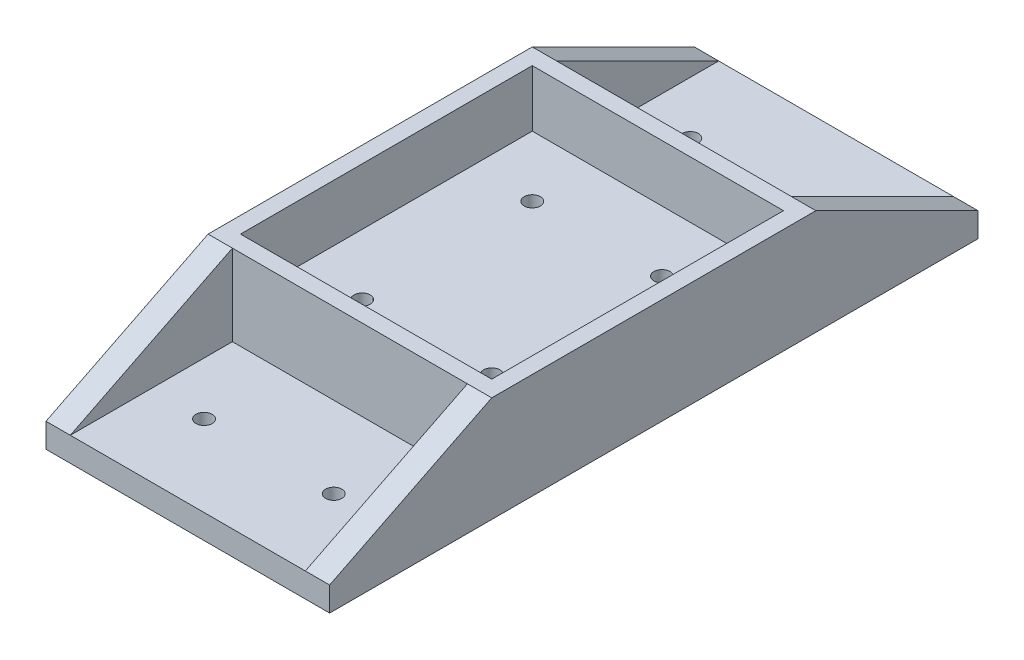
ISO-10303-21;
HEADER;
FILE_DESCRIPTION(('STEP AP214'),'2;1');
FILE_NAME('part.step','',(''),(''),'','','');
FILE_SCHEMA(('AUTOMOTIVE_DESIGN { 1 0 10303 214 1 1 1 1 }'));
ENDSEC;
DATA;
#1=APPLICATION_CONTEXT('core data for automotive mechanical design processes');
#2=APPLICATION_PROTOCOL_DEFINITION('international standard','automotive_design',2000,#1);
#3=PRODUCT_CONTEXT('',#1,'mechanical');
#4=PRODUCT('Part','Part','',(#3));
#5=PRODUCT_RELATED_PRODUCT_CATEGORY('part','',(#4));
#6=PRODUCT_DEFINITION_FORMATION('','',#4);
#7=PRODUCT_DEFINITION_CONTEXT('part definition',#1,'design');
#8=PRODUCT_DEFINITION('design','',#6,#7);
#9=PRODUCT_DEFINITION_SHAPE('','',#8);
#10=(LENGTH_UNIT() NAMED_UNIT(*) SI_UNIT(.MILLI.,.METRE.));
#11=(NAMED_UNIT(*) PLANE_ANGLE_UNIT() SI_UNIT($,.RADIAN.));
#12=(NAMED_UNIT(*) SI_UNIT($,.STERADIAN.) SOLID_ANGLE_UNIT());
#13=UNCERTAINTY_MEASURE_WITH_UNIT(LENGTH_MEASURE(1.E-05),#10,'distance_accuracy_value','');
#14=(GEOMETRIC_REPRESENTATION_CONTEXT(3) GLOBAL_UNCERTAINTY_ASSIGNED_CONTEXT((#13)) GLOBAL_UNIT_ASSIGNED_CONTEXT((#10,
#11,#12)) REPRESENTATION_CONTEXT('',''));
#15=CARTESIAN_POINT('',(0.,0.,0.));
#16=DIRECTION('',(0.,0.,1.));
#17=DIRECTION('',(1.,0.,0.));
#18=AXIS2_PLACEMENT_3D('',#15,#16,#17);
#19=CARTESIAN_POINT('',(-17.5,10.,20.));
#20=DIRECTION('',(0.,0.,-1.));
#21=DIRECTION('',(-1.,0.,0.));
#22=AXIS2_PLACEMENT_3D('',#19,#20,#21);
#23=PLANE('',#22);
#24=DIRECTION('',(0.,-1.,0.));
#25=VECTOR('',#24,1.);
#26=CARTESIAN_POINT('',(14.5,10.,20.));
#27=LINE('',#26,#25);
#28=CARTESIAN_POINT('',(14.5,10.,20.));
#29=VERTEX_POINT('',#28);
#30=CARTESIAN_POINT('',(14.5,0.,20.));
#31=VERTEX_POINT('',#30);
#32=EDGE_CURVE('E150',#29,#31,#27,.T.);
#33=ORIENTED_EDGE('',*,*,#32,.F.);
#34=DIRECTION('',(1.,0.,0.));
#35=VECTOR('',#34,1.);
#36=CARTESIAN_POINT('',(-17.5,10.,20.));
#37=LINE('',#36,#35);
#38=CARTESIAN_POINT('',(-14.5,10.,20.));
#39=VERTEX_POINT('',#38);
#40=EDGE_CURVE('E182',#39,#29,#37,.T.);
#41=ORIENTED_EDGE('',*,*,#40,.F.);
#42=DIRECTION('',(0.,-1.,0.));
#43=VECTOR('',#42,1.);
#44=CARTESIAN_POINT('',(-14.5,10.,20.));
#45=LINE('',#44,#43);
#46=CARTESIAN_POINT('',(-14.5,0.,20.));
#47=VERTEX_POINT('',#46);
#48=EDGE_CURVE('E170',#39,#47,#45,.T.);
#49=ORIENTED_EDGE('',*,*,#48,.T.);
#50=DIRECTION('',(1.,0.,0.));
#51=VECTOR('',#50,1.);
#52=CARTESIAN_POINT('',(-17.5,0.,20.));
#53=LINE('',#52,#51);
#54=EDGE_CURVE('E165',#47,#31,#53,.T.);
#55=ORIENTED_EDGE('',*,*,#54,.T.);
#56=EDGE_LOOP('',(#33,#41,#49,#55));
#57=FACE_BOUND('',#56,.T.);
#58=ADVANCED_FACE('F35',(#57),#23,.F.);
#59=CARTESIAN_POINT('',(0.,0.,0.));
#60=DIRECTION('',(0.,-1.,0.));
#61=DIRECTION('',(0.,0.,-1.));
#62=AXIS2_PLACEMENT_3D('',#59,#60,#61);
#63=PLANE('',#62);
#64=CARTESIAN_POINT('',(-8.00000000000001,0.,30.));
#65=DIRECTION('',(0.,-1.,0.));
#66=DIRECTION('',(0.,0.,-1.));
#67=AXIS2_PLACEMENT_3D('',#64,#65,#66);
#68=CIRCLE('',#67,1.);
#69=CARTESIAN_POINT('',(-8.00000000000001,0.,29.));
#70=VERTEX_POINT('',#69);
#71=EDGE_CURVE('E325',#70,#70,#68,.T.);
#72=ORIENTED_EDGE('',*,*,#71,.T.);
#73=EDGE_LOOP('',(#72));
#74=FACE_BOUND('',#73,.T.);
#75=CARTESIAN_POINT('',(8.00000000000001,0.,30.));
#76=DIRECTION('',(0.,-1.,0.));
#77=DIRECTION('',(0.,0.,-1.));
#78=AXIS2_PLACEMENT_3D('',#75,#76,#77);
#79=CIRCLE('',#78,1.);
#80=CARTESIAN_POINT('',(8.00000000000001,0.,29.));
#81=VERTEX_POINT('',#80);
#82=EDGE_CURVE('E319',#81,#81,#79,.T.);
#83=ORIENTED_EDGE('',*,*,#82,.T.);
#84=EDGE_LOOP('',(#83));
#85=FACE_BOUND('',#84,.T.);
#86=DIRECTION('',(0.,0.,1.));
#87=VECTOR('',#86,1.);
#88=CARTESIAN_POINT('',(14.5,0.,20.));
#89=LINE('',#88,#87);
#90=CARTESIAN_POINT('',(14.5,0.,40.));
#91=VERTEX_POINT('',#90);
#92=EDGE_CURVE('E153',#31,#91,#89,.T.);
#93=ORIENTED_EDGE('',*,*,#92,.F.);
#94=ORIENTED_EDGE('',*,*,#54,.F.);
#95=DIRECTION('',(0.,0.,1.));
#96=VECTOR('',#95,1.);
#97=CARTESIAN_POINT('',(-14.5,0.,20.));
#98=LINE('',#97,#96);
#99=CARTESIAN_POINT('',(-14.5,0.,40.));
#100=VERTEX_POINT('',#99);
#101=EDGE_CURVE('E257',#47,#100,#98,.T.);
#102=ORIENTED_EDGE('',*,*,#101,.T.);
#103=DIRECTION('',(-1.,0.,0.));
#104=VECTOR('',#103,1.);
#105=CARTESIAN_POINT('',(-17.5,0.,40.));
#106=LINE('',#105,#104);
#107=EDGE_CURVE('E166',#91,#100,#106,.T.);
#108=ORIENTED_EDGE('',*,*,#107,.F.);
#109=EDGE_LOOP('',(#93,#94,#102,#108));
#110=FACE_BOUND('',#109,.T.);
#111=ADVANCED_FACE('F163',(#74,#85,#110),#63,.F.);
#112=CARTESIAN_POINT('',(-17.5,10.,-20.));
#113=DIRECTION('',(1.,0.,0.));
#114=DIRECTION('',(0.,0.,-1.));
#115=AXIS2_PLACEMENT_3D('',#112,#113,#114);
#116=PLANE('',#115);
#117=DIRECTION('',(0.,0.,1.));
#118=VECTOR('',#117,1.);
#119=CARTESIAN_POINT('',(-17.5,10.,-20.));
#120=LINE('',#119,#118);
#121=CARTESIAN_POINT('',(-17.5,10.,-20.));
#122=VERTEX_POINT('',#121);
#123=CARTESIAN_POINT('',(-17.5,10.,20.));
#124=VERTEX_POINT('',#123);
#125=EDGE_CURVE('E172',#122,#124,#120,.T.);
#126=ORIENTED_EDGE('',*,*,#125,.F.);
#127=DIRECTION('',(0.,-0.447213595499958,-0.894427190999916));
#128=VECTOR('',#127,1.);
#129=CARTESIAN_POINT('',(-17.5,0.,-40.));
#130=LINE('',#129,#128);
#131=CARTESIAN_POINT('',(-17.5,0.,-40.));
#132=VERTEX_POINT('',#131);
#133=EDGE_CURVE('E245',#122,#132,#130,.T.);
#134=ORIENTED_EDGE('',*,*,#133,.T.);
#135=DIRECTION('',(0.,1.,0.));
#136=VECTOR('',#135,1.);
#137=CARTESIAN_POINT('',(-17.5,-3.,-40.));
#138=LINE('',#137,#136);
#139=CARTESIAN_POINT('',(-17.5,-3.,-40.));
#140=VERTEX_POINT('',#139);
#141=EDGE_CURVE('E204',#140,#132,#138,.T.);
#142=ORIENTED_EDGE('',*,*,#141,.F.);
#143=DIRECTION('',(0.,0.,-1.));
#144=VECTOR('',#143,1.);
#145=CARTESIAN_POINT('',(-17.5,-3.,40.));
#146=LINE('',#145,#144);
#147=CARTESIAN_POINT('',(-17.5,-3.,40.));
#148=VERTEX_POINT('',#147);
#149=EDGE_CURVE('E229',#148,#140,#146,.T.);
#150=ORIENTED_EDGE('',*,*,#149,.F.);
#151=DIRECTION('',(0.,1.,0.));
#152=VECTOR('',#151,1.);
#153=CARTESIAN_POINT('',(-17.5,-3.,40.));
#154=LINE('',#153,#152);
#155=CARTESIAN_POINT('',(-17.5,0.,40.));
#156=VERTEX_POINT('',#155);
#157=EDGE_CURVE('E223',#148,#156,#154,.T.);
#158=ORIENTED_EDGE('',*,*,#157,.T.);
#159=DIRECTION('',(0.,0.447213595499958,-0.894427190999916));
#160=VECTOR('',#159,1.);
#161=CARTESIAN_POINT('',(-17.5,0.,40.));
#162=LINE('',#161,#160);
#163=EDGE_CURVE('E258',#156,#124,#162,.T.);
#164=ORIENTED_EDGE('',*,*,#163,.T.);
#165=EDGE_LOOP('',(#126,#134,#142,#150,#158,#164));
#166=FACE_BOUND('',#165,.T.);
#167=ADVANCED_FACE('F37',(#166),#116,.F.);
#168=CARTESIAN_POINT('',(17.5,10.,-20.));
#169=DIRECTION('',(-1.,0.,0.));
#170=DIRECTION('',(0.,0.,1.));
#171=AXIS2_PLACEMENT_3D('',#168,#169,#170);
#172=PLANE('',#171);
#173=DIRECTION('',(0.,0.,-1.));
#174=VECTOR('',#173,1.);
#175=CARTESIAN_POINT('',(17.5,10.,-20.));
#176=LINE('',#175,#174);
#177=CARTESIAN_POINT('',(17.5,10.,20.));
#178=VERTEX_POINT('',#177);
#179=CARTESIAN_POINT('',(17.5,10.,-20.));
#180=VERTEX_POINT('',#179);
#181=EDGE_CURVE('E176',#178,#180,#176,.T.);
#182=ORIENTED_EDGE('',*,*,#181,.F.);
#183=DIRECTION('',(0.,0.447213595499958,-0.894427190999916));
#184=VECTOR('',#183,1.);
#185=CARTESIAN_POINT('',(17.5,0.,40.));
#186=LINE('',#185,#184);
#187=CARTESIAN_POINT('',(17.5,0.,40.));
#188=VERTEX_POINT('',#187);
#189=EDGE_CURVE('E279',#188,#178,#186,.T.);
#190=ORIENTED_EDGE('',*,*,#189,.F.);
#191=DIRECTION('',(0.,1.,0.));
#192=VECTOR('',#191,1.);
#193=CARTESIAN_POINT('',(17.5,-3.,40.));
#194=LINE('',#193,#192);
#195=CARTESIAN_POINT('',(17.5,-3.,40.));
#196=VERTEX_POINT('',#195);
#197=EDGE_CURVE('E220',#196,#188,#194,.T.);
#198=ORIENTED_EDGE('',*,*,#197,.F.);
#199=DIRECTION('',(0.,0.,1.));
#200=VECTOR('',#199,1.);
#201=CARTESIAN_POINT('',(17.5,-3.,40.));
#202=LINE('',#201,#200);
#203=CARTESIAN_POINT('',(17.5,-3.,-40.));
#204=VERTEX_POINT('',#203);
#205=EDGE_CURVE('E235',#204,#196,#202,.T.);
#206=ORIENTED_EDGE('',*,*,#205,.F.);
#207=DIRECTION('',(0.,1.,0.));
#208=VECTOR('',#207,1.);
#209=CARTESIAN_POINT('',(17.5,-3.,-40.));
#210=LINE('',#209,#208);
#211=CARTESIAN_POINT('',(17.5,0.,-40.));
#212=VERTEX_POINT('',#211);
#213=EDGE_CURVE('E217',#204,#212,#210,.T.);
#214=ORIENTED_EDGE('',*,*,#213,.T.);
#215=DIRECTION('',(0.,-0.447213595499958,-0.894427190999916));
#216=VECTOR('',#215,1.);
#217=CARTESIAN_POINT('',(17.5,0.,-40.));
#218=LINE('',#217,#216);
#219=EDGE_CURVE('E270',#180,#212,#218,.T.);
#220=ORIENTED_EDGE('',*,*,#219,.F.);
#221=EDGE_LOOP('',(#182,#190,#198,#206,#214,#220));
#222=FACE_BOUND('',#221,.T.);
#223=ADVANCED_FACE('F370',(#222),#172,.F.);
#224=CARTESIAN_POINT('',(-17.5,10.,-20.));
#225=DIRECTION('',(0.,0.,1.));
#226=DIRECTION('',(1.,0.,0.));
#227=AXIS2_PLACEMENT_3D('',#224,#225,#226);
#228=PLANE('',#227);
#229=DIRECTION('',(-1.,0.,0.));
#230=VECTOR('',#229,1.);
#231=CARTESIAN_POINT('',(-17.5,10.,-20.));
#232=LINE('',#231,#230);
#233=CARTESIAN_POINT('',(14.5,10.,-20.));
#234=VERTEX_POINT('',#233);
#235=CARTESIAN_POINT('',(-14.5,10.,-20.));
#236=VERTEX_POINT('',#235);
#237=EDGE_CURVE('E44',#234,#236,#232,.T.);
#238=ORIENTED_EDGE('',*,*,#237,.F.);
#239=DIRECTION('',(0.,1.,0.));
#240=VECTOR('',#239,1.);
#241=CARTESIAN_POINT('',(14.5,10.,-20.));
#242=LINE('',#241,#240);
#243=CARTESIAN_POINT('',(14.5,0.,-20.));
#244=VERTEX_POINT('',#243);
#245=EDGE_CURVE('E274',#244,#234,#242,.T.);
#246=ORIENTED_EDGE('',*,*,#245,.F.);
#247=DIRECTION('',(-1.,0.,0.));
#248=VECTOR('',#247,1.);
#249=CARTESIAN_POINT('',(-17.5,0.,-20.));
#250=LINE('',#249,#248);
#251=CARTESIAN_POINT('',(-14.5,0.,-20.));
#252=VERTEX_POINT('',#251);
#253=EDGE_CURVE('E39',#244,#252,#250,.T.);
#254=ORIENTED_EDGE('',*,*,#253,.T.);
#255=DIRECTION('',(0.,1.,0.));
#256=VECTOR('',#255,1.);
#257=CARTESIAN_POINT('',(-14.5,10.,-20.));
#258=LINE('',#257,#256);
#259=EDGE_CURVE('E244',#252,#236,#258,.T.);
#260=ORIENTED_EDGE('',*,*,#259,.T.);
#261=EDGE_LOOP('',(#238,#246,#254,#260));
#262=FACE_BOUND('',#261,.T.);
#263=ADVANCED_FACE('F383',(#262),#228,.F.);
#264=CARTESIAN_POINT('',(0.,10.,0.));
#265=DIRECTION('',(0.,1.,0.));
#266=DIRECTION('',(0.,0.,1.));
#267=AXIS2_PLACEMENT_3D('',#264,#265,#266);
#268=PLANE('',#267);
#269=DIRECTION('',(0.,0.,1.));
#270=VECTOR('',#269,1.);
#271=CARTESIAN_POINT('',(-15.5,10.,-18.));
#272=LINE('',#271,#270);
#273=CARTESIAN_POINT('',(-15.5,10.,-18.));
#274=VERTEX_POINT('',#273);
#275=CARTESIAN_POINT('',(-15.5,10.,18.));
#276=VERTEX_POINT('',#275);
#277=EDGE_CURVE('E202',#274,#276,#272,.T.);
#278=ORIENTED_EDGE('',*,*,#277,.F.);
#279=DIRECTION('',(-1.,0.,0.));
#280=VECTOR('',#279,1.);
#281=CARTESIAN_POINT('',(-15.5,10.,-18.));
#282=LINE('',#281,#280);
#283=CARTESIAN_POINT('',(15.5,10.,-18.));
#284=VERTEX_POINT('',#283);
#285=EDGE_CURVE('E192',#284,#274,#282,.T.);
#286=ORIENTED_EDGE('',*,*,#285,.F.);
#287=DIRECTION('',(0.,0.,-1.));
#288=VECTOR('',#287,1.);
#289=CARTESIAN_POINT('',(15.5,10.,-18.));
#290=LINE('',#289,#288);
#291=CARTESIAN_POINT('',(15.5,10.,18.));
#292=VERTEX_POINT('',#291);
#293=EDGE_CURVE('E196',#292,#284,#290,.T.);
#294=ORIENTED_EDGE('',*,*,#293,.F.);
#295=DIRECTION('',(1.,0.,0.));
#296=VECTOR('',#295,1.);
#297=CARTESIAN_POINT('',(-15.5,10.,18.));
#298=LINE('',#297,#296);
#299=EDGE_CURVE('E199',#276,#292,#298,.T.);
#300=ORIENTED_EDGE('',*,*,#299,.F.);
#301=EDGE_LOOP('',(#278,#286,#294,#300));
#302=FACE_BOUND('',#301,.T.);
#303=ORIENTED_EDGE('',*,*,#125,.T.);
#304=EDGE_CURVE('E179',#124,#39,#37,.T.);
#305=ORIENTED_EDGE('',*,*,#304,.T.);
#306=ORIENTED_EDGE('',*,*,#40,.T.);
#307=DIRECTION('',(1.,0.,0.));
#308=VECTOR('',#307,1.);
#309=CARTESIAN_POINT('',(14.5,10.,20.));
#310=LINE('',#309,#308);
#311=EDGE_CURVE('E159',#29,#178,#310,.T.);
#312=ORIENTED_EDGE('',*,*,#311,.T.);
#313=ORIENTED_EDGE('',*,*,#181,.T.);
#314=EDGE_CURVE('E11',#180,#234,#232,.T.);
#315=ORIENTED_EDGE('',*,*,#314,.T.);
#316=ORIENTED_EDGE('',*,*,#237,.T.);
#317=DIRECTION('',(-1.,0.,0.));
#318=VECTOR('',#317,1.);
#319=CARTESIAN_POINT('',(-14.5,10.,-20.));
#320=LINE('',#319,#318);
#321=EDGE_CURVE('E241',#236,#122,#320,.T.);
#322=ORIENTED_EDGE('',*,*,#321,.T.);
#323=EDGE_LOOP('',(#303,#305,#306,#312,#313,#315,#316,#322));
#324=FACE_BOUND('',#323,.T.);
#325=ADVANCED_FACE('F376',(#302,#324),#268,.T.);
#326=CARTESIAN_POINT('',(-15.5,3.,-18.));
#327=DIRECTION('',(-1.,0.,0.));
#328=DIRECTION('',(0.,0.,1.));
#329=AXIS2_PLACEMENT_3D('',#326,#327,#328);
#330=PLANE('',#329);
#331=ORIENTED_EDGE('',*,*,#277,.T.);
#332=DIRECTION('',(0.,1.,0.));
#333=VECTOR('',#332,1.);
#334=CARTESIAN_POINT('',(-15.5,3.,18.));
#335=LINE('',#334,#333);
#336=CARTESIAN_POINT('',(-15.5,3.,18.));
#337=VERTEX_POINT('',#336);
#338=EDGE_CURVE('E185',#337,#276,#335,.T.);
#339=ORIENTED_EDGE('',*,*,#338,.F.);
#340=DIRECTION('',(0.,0.,1.));
#341=VECTOR('',#340,1.);
#342=CARTESIAN_POINT('',(-15.5,3.,-18.));
#343=LINE('',#342,#341);
#344=CARTESIAN_POINT('',(-15.5,3.,-18.));
#345=VERTEX_POINT('',#344);
#346=EDGE_CURVE('E195',#345,#337,#343,.T.);
#347=ORIENTED_EDGE('',*,*,#346,.F.);
#348=DIRECTION('',(0.,1.,0.));
#349=VECTOR('',#348,1.);
#350=CARTESIAN_POINT('',(-15.5,3.,-18.));
#351=LINE('',#350,#349);
#352=EDGE_CURVE('E171',#345,#274,#351,.T.);
#353=ORIENTED_EDGE('',*,*,#352,.T.);
#354=EDGE_LOOP('',(#331,#339,#347,#353));
#355=FACE_BOUND('',#354,.T.);
#356=ADVANCED_FACE('F420',(#355),#330,.F.);
#357=CARTESIAN_POINT('',(-15.5,3.,-18.));
#358=DIRECTION('',(0.,0.,-1.));
#359=DIRECTION('',(-1.,0.,0.));
#360=AXIS2_PLACEMENT_3D('',#357,#358,#359);
#361=PLANE('',#360);
#362=ORIENTED_EDGE('',*,*,#285,.T.);
#363=ORIENTED_EDGE('',*,*,#352,.F.);
#364=DIRECTION('',(-1.,0.,0.));
#365=VECTOR('',#364,1.);
#366=CARTESIAN_POINT('',(-15.5,3.,-18.));
#367=LINE('',#366,#365);
#368=CARTESIAN_POINT('',(15.5,3.,-18.));
#369=VERTEX_POINT('',#368);
#370=EDGE_CURVE('E189',#369,#345,#367,.T.);
#371=ORIENTED_EDGE('',*,*,#370,.F.);
#372=DIRECTION('',(0.,1.,0.));
#373=VECTOR('',#372,1.);
#374=CARTESIAN_POINT('',(15.5,3.,-18.));
#375=LINE('',#374,#373);
#376=EDGE_CURVE('E173',#369,#284,#375,.T.);
#377=ORIENTED_EDGE('',*,*,#376,.T.);
#378=EDGE_LOOP('',(#362,#363,#371,#377));
#379=FACE_BOUND('',#378,.T.);
#380=ADVANCED_FACE('F424',(#379),#361,.F.);
#381=CARTESIAN_POINT('',(15.5,3.,-18.));
#382=DIRECTION('',(1.,0.,0.));
#383=DIRECTION('',(0.,0.,-1.));
#384=AXIS2_PLACEMENT_3D('',#381,#382,#383);
#385=PLANE('',#384);
#386=ORIENTED_EDGE('',*,*,#293,.T.);
#387=ORIENTED_EDGE('',*,*,#376,.F.);
#388=DIRECTION('',(0.,0.,-1.));
#389=VECTOR('',#388,1.);
#390=CARTESIAN_POINT('',(15.5,3.,-18.));
#391=LINE('',#390,#389);
#392=CARTESIAN_POINT('',(15.5,3.,18.));
#393=VERTEX_POINT('',#392);
#394=EDGE_CURVE('E207',#393,#369,#391,.T.);
#395=ORIENTED_EDGE('',*,*,#394,.F.);
#396=DIRECTION('',(0.,1.,0.));
#397=VECTOR('',#396,1.);
#398=CARTESIAN_POINT('',(15.5,3.,18.));
#399=LINE('',#398,#397);
#400=EDGE_CURVE('E188',#393,#292,#399,.T.);
#401=ORIENTED_EDGE('',*,*,#400,.T.);
#402=EDGE_LOOP('',(#386,#387,#395,#401));
#403=FACE_BOUND('',#402,.T.);
#404=ADVANCED_FACE('F430',(#403),#385,.F.);
#405=CARTESIAN_POINT('',(-15.5,3.,18.));
#406=DIRECTION('',(0.,0.,1.));
#407=DIRECTION('',(1.,0.,0.));
#408=AXIS2_PLACEMENT_3D('',#405,#406,#407);
#409=PLANE('',#408);
#410=ORIENTED_EDGE('',*,*,#299,.T.);
#411=ORIENTED_EDGE('',*,*,#400,.F.);
#412=DIRECTION('',(1.,0.,0.));
#413=VECTOR('',#412,1.);
#414=CARTESIAN_POINT('',(-15.5,3.,18.));
#415=LINE('',#414,#413);
#416=EDGE_CURVE('E210',#337,#393,#415,.T.);
#417=ORIENTED_EDGE('',*,*,#416,.F.);
#418=ORIENTED_EDGE('',*,*,#338,.T.);
#419=EDGE_LOOP('',(#410,#411,#417,#418));
#420=FACE_BOUND('',#419,.T.);
#421=ADVANCED_FACE('F426',(#420),#409,.F.);
#422=CARTESIAN_POINT('',(0.,3.,0.));
#423=DIRECTION('',(0.,1.,0.));
#424=DIRECTION('',(0.,0.,1.));
#425=AXIS2_PLACEMENT_3D('',#422,#423,#424);
#426=PLANE('',#425);
#427=CARTESIAN_POINT('',(8.00000000000001,3.,-10.5));
#428=DIRECTION('',(0.,1.,0.));
#429=DIRECTION('',(0.,0.,1.));
#430=AXIS2_PLACEMENT_3D('',#427,#428,#429);
#431=CIRCLE('',#430,1.);
#432=CARTESIAN_POINT('',(8.00000000000001,3.,-9.5));
#433=VERTEX_POINT('',#432);
#434=EDGE_CURVE('E296',#433,#433,#431,.T.);
#435=ORIENTED_EDGE('',*,*,#434,.F.);
#436=EDGE_LOOP('',(#435));
#437=FACE_BOUND('',#436,.T.);
#438=CARTESIAN_POINT('',(-7.99999999999999,3.,10.5));
#439=DIRECTION('',(0.,1.,0.));
#440=DIRECTION('',(0.,0.,1.));
#441=AXIS2_PLACEMENT_3D('',#438,#439,#440);
#442=CIRCLE('',#441,1.);
#443=CARTESIAN_POINT('',(-7.99999999999999,3.,11.5));
#444=VERTEX_POINT('',#443);
#445=EDGE_CURVE('E289',#444,#444,#442,.T.);
#446=ORIENTED_EDGE('',*,*,#445,.F.);
#447=EDGE_LOOP('',(#446));
#448=FACE_BOUND('',#447,.T.);
#449=CARTESIAN_POINT('',(8.00000000000001,3.,10.5));
#450=DIRECTION('',(0.,1.,0.));
#451=DIRECTION('',(0.,0.,1.));
#452=AXIS2_PLACEMENT_3D('',#449,#450,#451);
#453=CIRCLE('',#452,1.);
#454=CARTESIAN_POINT('',(8.00000000000001,3.,11.5));
#455=VERTEX_POINT('',#454);
#456=EDGE_CURVE('E301',#455,#455,#453,.T.);
#457=ORIENTED_EDGE('',*,*,#456,.F.);
#458=EDGE_LOOP('',(#457));
#459=FACE_BOUND('',#458,.T.);
#460=CARTESIAN_POINT('',(-7.99999999999999,3.,-10.5));
#461=DIRECTION('',(0.,1.,0.));
#462=DIRECTION('',(0.,0.,1.));
#463=AXIS2_PLACEMENT_3D('',#460,#461,#462);
#464=CIRCLE('',#463,1.);
#465=CARTESIAN_POINT('',(-7.99999999999999,3.,-9.5));
#466=VERTEX_POINT('',#465);
#467=EDGE_CURVE('E283',#466,#466,#464,.T.);
#468=ORIENTED_EDGE('',*,*,#467,.F.);
#469=EDGE_LOOP('',(#468));
#470=FACE_BOUND('',#469,.T.);
#471=ORIENTED_EDGE('',*,*,#346,.T.);
#472=ORIENTED_EDGE('',*,*,#416,.T.);
#473=ORIENTED_EDGE('',*,*,#394,.T.);
#474=ORIENTED_EDGE('',*,*,#370,.T.);
#475=EDGE_LOOP('',(#471,#472,#473,#474));
#476=FACE_BOUND('',#475,.T.);
#477=ADVANCED_FACE('F429',(#437,#448,#459,#470,#476),#426,.T.);
#478=CARTESIAN_POINT('',(-8.00000000000001,0.,-30.));
#479=DIRECTION('',(0.,1.,0.));
#480=DIRECTION('',(0.,0.,1.));
#481=AXIS2_PLACEMENT_3D('',#478,#479,#480);
#482=CIRCLE('',#481,1.);
#483=CARTESIAN_POINT('',(-8.00000000000001,0.,-29.));
#484=VERTEX_POINT('',#483);
#485=EDGE_CURVE('E314',#484,#484,#482,.T.);
#486=ORIENTED_EDGE('',*,*,#485,.F.);
#487=EDGE_LOOP('',(#486));
#488=FACE_BOUND('',#487,.T.);
#489=CARTESIAN_POINT('',(8.00000000000001,0.,-30.));
#490=DIRECTION('',(0.,1.,0.));
#491=DIRECTION('',(0.,0.,1.));
#492=AXIS2_PLACEMENT_3D('',#489,#490,#491);
#493=CIRCLE('',#492,1.);
#494=CARTESIAN_POINT('',(8.00000000000001,0.,-29.));
#495=VERTEX_POINT('',#494);
#496=EDGE_CURVE('E307',#495,#495,#493,.T.);
#497=ORIENTED_EDGE('',*,*,#496,.F.);
#498=EDGE_LOOP('',(#497));
#499=FACE_BOUND('',#498,.T.);
#500=ORIENTED_EDGE('',*,*,#253,.F.);
#501=DIRECTION('',(0.,0.,1.));
#502=VECTOR('',#501,1.);
#503=CARTESIAN_POINT('',(14.5,0.,-20.));
#504=LINE('',#503,#502);
#505=CARTESIAN_POINT('',(14.5,0.,-40.));
#506=VERTEX_POINT('',#505);
#507=EDGE_CURVE('E269',#506,#244,#504,.T.);
#508=ORIENTED_EDGE('',*,*,#507,.F.);
#509=DIRECTION('',(1.,0.,0.));
#510=VECTOR('',#509,1.);
#511=CARTESIAN_POINT('',(-17.5,0.,-40.));
#512=LINE('',#511,#510);
#513=CARTESIAN_POINT('',(-14.5,0.,-40.));
#514=VERTEX_POINT('',#513);
#515=EDGE_CURVE('E233',#514,#506,#512,.T.);
#516=ORIENTED_EDGE('',*,*,#515,.F.);
#517=DIRECTION('',(0.,0.,1.));
#518=VECTOR('',#517,1.);
#519=CARTESIAN_POINT('',(-14.5,0.,-20.));
#520=LINE('',#519,#518);
#521=EDGE_CURVE('E251',#514,#252,#520,.T.);
#522=ORIENTED_EDGE('',*,*,#521,.T.);
#523=EDGE_LOOP('',(#500,#508,#516,#522));
#524=FACE_BOUND('',#523,.T.);
#525=ADVANCED_FACE('F388',(#488,#499,#524),#63,.F.);
#526=CARTESIAN_POINT('',(-17.5,-3.,-40.));
#527=DIRECTION('',(0.,0.,1.));
#528=DIRECTION('',(1.,0.,0.));
#529=AXIS2_PLACEMENT_3D('',#526,#527,#528);
#530=PLANE('',#529);
#531=EDGE_CURVE('E230',#132,#514,#512,.T.);
#532=ORIENTED_EDGE('',*,*,#531,.T.);
#533=ORIENTED_EDGE('',*,*,#515,.T.);
#534=DIRECTION('',(1.,0.,0.));
#535=VECTOR('',#534,1.);
#536=CARTESIAN_POINT('',(14.5,0.,-40.));
#537=LINE('',#536,#535);
#538=EDGE_CURVE('E262',#506,#212,#537,.T.);
#539=ORIENTED_EDGE('',*,*,#538,.T.);
#540=ORIENTED_EDGE('',*,*,#213,.F.);
#541=DIRECTION('',(1.,0.,0.));
#542=VECTOR('',#541,1.);
#543=CARTESIAN_POINT('',(-17.5,-3.,-40.));
#544=LINE('',#543,#542);
#545=EDGE_CURVE('E237',#140,#204,#544,.T.);
#546=ORIENTED_EDGE('',*,*,#545,.F.);
#547=ORIENTED_EDGE('',*,*,#141,.T.);
#548=EDGE_LOOP('',(#532,#533,#539,#540,#546,#547));
#549=FACE_BOUND('',#548,.T.);
#550=ADVANCED_FACE('F362',(#549),#530,.F.);
#551=CARTESIAN_POINT('',(-17.5,-3.,40.));
#552=DIRECTION('',(0.,0.,-1.));
#553=DIRECTION('',(-1.,0.,0.));
#554=AXIS2_PLACEMENT_3D('',#551,#552,#553);
#555=PLANE('',#554);
#556=EDGE_CURVE('E227',#188,#91,#106,.T.);
#557=ORIENTED_EDGE('',*,*,#556,.T.);
#558=ORIENTED_EDGE('',*,*,#107,.T.);
#559=DIRECTION('',(-1.,0.,0.));
#560=VECTOR('',#559,1.);
#561=CARTESIAN_POINT('',(-14.5,0.,40.));
#562=LINE('',#561,#560);
#563=EDGE_CURVE('E248',#100,#156,#562,.T.);
#564=ORIENTED_EDGE('',*,*,#563,.T.);
#565=ORIENTED_EDGE('',*,*,#157,.F.);
#566=DIRECTION('',(-1.,0.,0.));
#567=VECTOR('',#566,1.);
#568=CARTESIAN_POINT('',(-17.5,-3.,40.));
#569=LINE('',#568,#567);
#570=EDGE_CURVE('E226',#196,#148,#569,.T.);
#571=ORIENTED_EDGE('',*,*,#570,.F.);
#572=ORIENTED_EDGE('',*,*,#197,.T.);
#573=EDGE_LOOP('',(#557,#558,#564,#565,#571,#572));
#574=FACE_BOUND('',#573,.T.);
#575=ADVANCED_FACE('F338',(#574),#555,.F.);
#576=CARTESIAN_POINT('',(0.,-3.,0.));
#577=DIRECTION('',(0.,-1.,0.));
#578=DIRECTION('',(0.,0.,-1.));
#579=AXIS2_PLACEMENT_3D('',#576,#577,#578);
#580=PLANE('',#579);
#581=CARTESIAN_POINT('',(-8.00000000000001,-3.,30.));
#582=DIRECTION('',(0.,-1.,0.));
#583=DIRECTION('',(0.,0.,-1.));
#584=AXIS2_PLACEMENT_3D('',#581,#582,#583);
#585=CIRCLE('',#584,1.);
#586=CARTESIAN_POINT('',(-8.00000000000001,-3.,29.));
#587=VERTEX_POINT('',#586);
#588=EDGE_CURVE('E311',#587,#587,#585,.T.);
#589=ORIENTED_EDGE('',*,*,#588,.F.);
#590=EDGE_LOOP('',(#589));
#591=FACE_BOUND('',#590,.T.);
#592=CARTESIAN_POINT('',(8.00000000000001,-3.,30.));
#593=DIRECTION('',(0.,-1.,0.));
#594=DIRECTION('',(0.,0.,-1.));
#595=AXIS2_PLACEMENT_3D('',#592,#593,#594);
#596=CIRCLE('',#595,1.);
#597=CARTESIAN_POINT('',(8.00000000000001,-3.,29.));
#598=VERTEX_POINT('',#597);
#599=EDGE_CURVE('E322',#598,#598,#596,.T.);
#600=ORIENTED_EDGE('',*,*,#599,.F.);
#601=EDGE_LOOP('',(#600));
#602=FACE_BOUND('',#601,.T.);
#603=CARTESIAN_POINT('',(-8.00000000000001,-3.,-30.));
#604=DIRECTION('',(0.,1.,0.));
#605=DIRECTION('',(0.,0.,1.));
#606=AXIS2_PLACEMENT_3D('',#603,#604,#605);
#607=CIRCLE('',#606,1.);
#608=CARTESIAN_POINT('',(-8.00000000000001,-3.,-29.));
#609=VERTEX_POINT('',#608);
#610=EDGE_CURVE('E304',#609,#609,#607,.T.);
#611=ORIENTED_EDGE('',*,*,#610,.T.);
#612=EDGE_LOOP('',(#611));
#613=FACE_BOUND('',#612,.T.);
#614=CARTESIAN_POINT('',(8.00000000000001,-3.,-30.));
#615=DIRECTION('',(0.,1.,0.));
#616=DIRECTION('',(0.,0.,1.));
#617=AXIS2_PLACEMENT_3D('',#614,#615,#616);
#618=CIRCLE('',#617,1.);
#619=CARTESIAN_POINT('',(8.00000000000001,-3.,-29.));
#620=VERTEX_POINT('',#619);
#621=EDGE_CURVE('E310',#620,#620,#618,.T.);
#622=ORIENTED_EDGE('',*,*,#621,.T.);
#623=EDGE_LOOP('',(#622));
#624=FACE_BOUND('',#623,.T.);
#625=CARTESIAN_POINT('',(8.00000000000001,-3.,-10.5));
#626=DIRECTION('',(0.,1.,0.));
#627=DIRECTION('',(0.,0.,1.));
#628=AXIS2_PLACEMENT_3D('',#625,#626,#627);
#629=CIRCLE('',#628,1.);
#630=CARTESIAN_POINT('',(8.00000000000001,-3.,-9.5));
#631=VERTEX_POINT('',#630);
#632=EDGE_CURVE('E286',#631,#631,#629,.T.);
#633=ORIENTED_EDGE('',*,*,#632,.T.);
#634=EDGE_LOOP('',(#633));
#635=FACE_BOUND('',#634,.T.);
#636=CARTESIAN_POINT('',(-7.99999999999999,-3.,10.5));
#637=DIRECTION('',(0.,1.,0.));
#638=DIRECTION('',(0.,0.,1.));
#639=AXIS2_PLACEMENT_3D('',#636,#637,#638);
#640=CIRCLE('',#639,1.);
#641=CARTESIAN_POINT('',(-7.99999999999999,-3.,11.5));
#642=VERTEX_POINT('',#641);
#643=EDGE_CURVE('E292',#642,#642,#640,.T.);
#644=ORIENTED_EDGE('',*,*,#643,.T.);
#645=EDGE_LOOP('',(#644));
#646=FACE_BOUND('',#645,.T.);
#647=CARTESIAN_POINT('',(8.00000000000001,-3.,10.5));
#648=DIRECTION('',(0.,1.,0.));
#649=DIRECTION('',(0.,0.,1.));
#650=AXIS2_PLACEMENT_3D('',#647,#648,#649);
#651=CIRCLE('',#650,1.);
#652=CARTESIAN_POINT('',(8.00000000000001,-3.,11.5));
#653=VERTEX_POINT('',#652);
#654=EDGE_CURVE('E293',#653,#653,#651,.T.);
#655=ORIENTED_EDGE('',*,*,#654,.T.);
#656=EDGE_LOOP('',(#655));
#657=FACE_BOUND('',#656,.T.);
#658=CARTESIAN_POINT('',(-7.99999999999999,-3.,-10.5));
#659=DIRECTION('',(0.,1.,0.));
#660=DIRECTION('',(0.,0.,1.));
#661=AXIS2_PLACEMENT_3D('',#658,#659,#660);
#662=CIRCLE('',#661,1.);
#663=CARTESIAN_POINT('',(-7.99999999999999,-3.,-9.5));
#664=VERTEX_POINT('',#663);
#665=EDGE_CURVE('E280',#664,#664,#662,.T.);
#666=ORIENTED_EDGE('',*,*,#665,.T.);
#667=EDGE_LOOP('',(#666));
#668=FACE_BOUND('',#667,.T.);
#669=ORIENTED_EDGE('',*,*,#149,.T.);
#670=ORIENTED_EDGE('',*,*,#545,.T.);
#671=ORIENTED_EDGE('',*,*,#205,.T.);
#672=ORIENTED_EDGE('',*,*,#570,.T.);
#673=EDGE_LOOP('',(#669,#670,#671,#672));
#674=FACE_BOUND('',#673,.T.);
#675=ADVANCED_FACE('F334',(#591,#602,#613,#624,#635,#646,#657,#668,#674),#580,.T.);
#676=CARTESIAN_POINT('',(-14.5,0.,-40.));
#677=DIRECTION('',(0.,0.894427190999916,-0.447213595499958));
#678=DIRECTION('',(0.,0.447213595499958,0.894427190999916));
#679=AXIS2_PLACEMENT_3D('',#676,#677,#678);
#680=PLANE('',#679);
#681=ORIENTED_EDGE('',*,*,#133,.F.);
#682=ORIENTED_EDGE('',*,*,#321,.F.);
#683=DIRECTION('',(0.,-0.447213595499958,-0.894427190999916));
#684=VECTOR('',#683,1.);
#685=CARTESIAN_POINT('',(-14.5,0.,-40.));
#686=LINE('',#685,#684);
#687=EDGE_CURVE('E60',#236,#514,#686,.T.);
#688=ORIENTED_EDGE('',*,*,#687,.T.);
#689=ORIENTED_EDGE('',*,*,#531,.F.);
#690=EDGE_LOOP('',(#681,#682,#688,#689));
#691=FACE_BOUND('',#690,.T.);
#692=ADVANCED_FACE('F337',(#691),#680,.T.);
#693=CARTESIAN_POINT('',(-14.5,0.,0.));
#694=DIRECTION('',(1.,0.,0.));
#695=DIRECTION('',(0.,0.,-1.));
#696=AXIS2_PLACEMENT_3D('',#693,#694,#695);
#697=PLANE('',#696);
#698=ORIENTED_EDGE('',*,*,#687,.F.);
#699=ORIENTED_EDGE('',*,*,#259,.F.);
#700=ORIENTED_EDGE('',*,*,#521,.F.);
#701=EDGE_LOOP('',(#698,#699,#700));
#702=FACE_BOUND('',#701,.T.);
#703=ADVANCED_FACE('F380',(#702),#697,.T.);
#704=CARTESIAN_POINT('',(-14.5,0.,40.));
#705=DIRECTION('',(0.,0.894427190999916,0.447213595499958));
#706=DIRECTION('',(0.,-0.447213595499958,0.894427190999916));
#707=AXIS2_PLACEMENT_3D('',#704,#705,#706);
#708=PLANE('',#707);
#709=ORIENTED_EDGE('',*,*,#163,.F.);
#710=ORIENTED_EDGE('',*,*,#563,.F.);
#711=DIRECTION('',(0.,0.447213595499958,-0.894427190999916));
#712=VECTOR('',#711,1.);
#713=CARTESIAN_POINT('',(-14.5,0.,40.));
#714=LINE('',#713,#712);
#715=EDGE_CURVE('E261',#100,#39,#714,.T.);
#716=ORIENTED_EDGE('',*,*,#715,.T.);
#717=ORIENTED_EDGE('',*,*,#304,.F.);
#718=EDGE_LOOP('',(#709,#710,#716,#717));
#719=FACE_BOUND('',#718,.T.);
#720=ADVANCED_FACE('F396',(#719),#708,.T.);
#721=CARTESIAN_POINT('',(-14.5,0.,0.));
#722=DIRECTION('',(-1.,0.,0.));
#723=DIRECTION('',(0.,0.,1.));
#724=AXIS2_PLACEMENT_3D('',#721,#722,#723);
#725=PLANE('',#724);
#726=ORIENTED_EDGE('',*,*,#715,.F.);
#727=ORIENTED_EDGE('',*,*,#101,.F.);
#728=ORIENTED_EDGE('',*,*,#48,.F.);
#729=EDGE_LOOP('',(#726,#727,#728));
#730=FACE_BOUND('',#729,.T.);
#731=ADVANCED_FACE('F398',(#730),#725,.F.);
#732=CARTESIAN_POINT('',(14.5,0.,-40.));
#733=DIRECTION('',(0.,-0.894427190999916,0.447213595499958));
#734=DIRECTION('',(0.,-0.447213595499958,-0.894427190999916));
#735=AXIS2_PLACEMENT_3D('',#732,#733,#734);
#736=PLANE('',#735);
#737=ORIENTED_EDGE('',*,*,#219,.T.);
#738=ORIENTED_EDGE('',*,*,#538,.F.);
#739=DIRECTION('',(0.,-0.447213595499958,-0.894427190999916));
#740=VECTOR('',#739,1.);
#741=CARTESIAN_POINT('',(14.5,0.,-40.));
#742=LINE('',#741,#740);
#743=EDGE_CURVE('E272',#234,#506,#742,.T.);
#744=ORIENTED_EDGE('',*,*,#743,.F.);
#745=ORIENTED_EDGE('',*,*,#314,.F.);
#746=EDGE_LOOP('',(#737,#738,#744,#745));
#747=FACE_BOUND('',#746,.T.);
#748=ADVANCED_FACE('F393',(#747),#736,.F.);
#749=CARTESIAN_POINT('',(14.5,0.,0.));
#750=DIRECTION('',(-1.,0.,0.));
#751=DIRECTION('',(0.,0.,-1.));
#752=AXIS2_PLACEMENT_3D('',#749,#750,#751);
#753=PLANE('',#752);
#754=ORIENTED_EDGE('',*,*,#743,.T.);
#755=ORIENTED_EDGE('',*,*,#507,.T.);
#756=ORIENTED_EDGE('',*,*,#245,.T.);
#757=EDGE_LOOP('',(#754,#755,#756));
#758=FACE_BOUND('',#757,.T.);
#759=ADVANCED_FACE('F390',(#758),#753,.T.);
#760=CARTESIAN_POINT('',(14.5,0.,40.));
#761=DIRECTION('',(0.,-0.894427190999916,-0.447213595499958));
#762=DIRECTION('',(0.,0.447213595499958,-0.894427190999916));
#763=AXIS2_PLACEMENT_3D('',#760,#761,#762);
#764=PLANE('',#763);
#765=ORIENTED_EDGE('',*,*,#189,.T.);
#766=ORIENTED_EDGE('',*,*,#311,.F.);
#767=DIRECTION('',(0.,0.447213595499958,-0.894427190999916));
#768=VECTOR('',#767,1.);
#769=CARTESIAN_POINT('',(14.5,0.,40.));
#770=LINE('',#769,#768);
#771=EDGE_CURVE('E52',#91,#29,#770,.T.);
#772=ORIENTED_EDGE('',*,*,#771,.F.);
#773=ORIENTED_EDGE('',*,*,#556,.F.);
#774=EDGE_LOOP('',(#765,#766,#772,#773));
#775=FACE_BOUND('',#774,.T.);
#776=ADVANCED_FACE('F394',(#775),#764,.F.);
#777=CARTESIAN_POINT('',(14.5,0.,0.));
#778=DIRECTION('',(1.,0.,0.));
#779=DIRECTION('',(0.,0.,1.));
#780=AXIS2_PLACEMENT_3D('',#777,#778,#779);
#781=PLANE('',#780);
#782=ORIENTED_EDGE('',*,*,#771,.T.);
#783=ORIENTED_EDGE('',*,*,#32,.T.);
#784=ORIENTED_EDGE('',*,*,#92,.T.);
#785=EDGE_LOOP('',(#782,#783,#784));
#786=FACE_BOUND('',#785,.T.);
#787=ADVANCED_FACE('F152',(#786),#781,.F.);
#788=CARTESIAN_POINT('',(-7.99999999999999,-3.,-10.5));
#789=DIRECTION('',(0.,1.,0.));
#790=DIRECTION('',(0.,0.,1.));
#791=AXIS2_PLACEMENT_3D('',#788,#789,#790);
#792=CYLINDRICAL_SURFACE('',#791,1.);
#793=ORIENTED_EDGE('',*,*,#665,.F.);
#794=EDGE_LOOP('',(#793));
#795=FACE_BOUND('',#794,.T.);
#796=ORIENTED_EDGE('',*,*,#467,.T.);
#797=EDGE_LOOP('',(#796));
#798=FACE_BOUND('',#797,.T.);
#799=ADVANCED_FACE('F533',(#795,#798),#792,.F.);
#800=CARTESIAN_POINT('',(8.00000000000001,-3.,10.5));
#801=DIRECTION('',(0.,1.,0.));
#802=DIRECTION('',(0.,0.,1.));
#803=AXIS2_PLACEMENT_3D('',#800,#801,#802);
#804=CYLINDRICAL_SURFACE('',#803,1.);
#805=ORIENTED_EDGE('',*,*,#654,.F.);
#806=EDGE_LOOP('',(#805));
#807=FACE_BOUND('',#806,.T.);
#808=ORIENTED_EDGE('',*,*,#456,.T.);
#809=EDGE_LOOP('',(#808));
#810=FACE_BOUND('',#809,.T.);
#811=ADVANCED_FACE('F550',(#807,#810),#804,.F.);
#812=CARTESIAN_POINT('',(-7.99999999999999,-3.,10.5));
#813=DIRECTION('',(0.,1.,0.));
#814=DIRECTION('',(0.,0.,1.));
#815=AXIS2_PLACEMENT_3D('',#812,#813,#814);
#816=CYLINDRICAL_SURFACE('',#815,1.);
#817=ORIENTED_EDGE('',*,*,#643,.F.);
#818=EDGE_LOOP('',(#817));
#819=FACE_BOUND('',#818,.T.);
#820=ORIENTED_EDGE('',*,*,#445,.T.);
#821=EDGE_LOOP('',(#820));
#822=FACE_BOUND('',#821,.T.);
#823=ADVANCED_FACE('F560',(#819,#822),#816,.F.);
#824=CARTESIAN_POINT('',(8.00000000000001,-3.,-10.5));
#825=DIRECTION('',(0.,1.,0.));
#826=DIRECTION('',(0.,0.,1.));
#827=AXIS2_PLACEMENT_3D('',#824,#825,#826);
#828=CYLINDRICAL_SURFACE('',#827,1.);
#829=ORIENTED_EDGE('',*,*,#632,.F.);
#830=EDGE_LOOP('',(#829));
#831=FACE_BOUND('',#830,.T.);
#832=ORIENTED_EDGE('',*,*,#434,.T.);
#833=EDGE_LOOP('',(#832));
#834=FACE_BOUND('',#833,.T.);
#835=ADVANCED_FACE('F570',(#831,#834),#828,.F.);
#836=CARTESIAN_POINT('',(8.00000000000001,-3.,-30.));
#837=DIRECTION('',(0.,1.,0.));
#838=DIRECTION('',(0.,0.,1.));
#839=AXIS2_PLACEMENT_3D('',#836,#837,#838);
#840=CYLINDRICAL_SURFACE('',#839,1.);
#841=ORIENTED_EDGE('',*,*,#621,.F.);
#842=EDGE_LOOP('',(#841));
#843=FACE_BOUND('',#842,.T.);
#844=ORIENTED_EDGE('',*,*,#496,.T.);
#845=EDGE_LOOP('',(#844));
#846=FACE_BOUND('',#845,.T.);
#847=ADVANCED_FACE('F580',(#843,#846),#840,.F.);
#848=CARTESIAN_POINT('',(-8.00000000000001,-3.,-30.));
#849=DIRECTION('',(0.,1.,0.));
#850=DIRECTION('',(0.,0.,1.));
#851=AXIS2_PLACEMENT_3D('',#848,#849,#850);
#852=CYLINDRICAL_SURFACE('',#851,1.);
#853=ORIENTED_EDGE('',*,*,#610,.F.);
#854=EDGE_LOOP('',(#853));
#855=FACE_BOUND('',#854,.T.);
#856=ORIENTED_EDGE('',*,*,#485,.T.);
#857=EDGE_LOOP('',(#856));
#858=FACE_BOUND('',#857,.T.);
#859=ADVANCED_FACE('F596',(#855,#858),#852,.F.);
#860=CARTESIAN_POINT('',(8.00000000000001,-3.,30.));
#861=DIRECTION('',(0.,1.,0.));
#862=DIRECTION('',(0.,0.,1.));
#863=AXIS2_PLACEMENT_3D('',#860,#861,#862);
#864=CYLINDRICAL_SURFACE('',#863,1.);
#865=ORIENTED_EDGE('',*,*,#599,.T.);
#866=EDGE_LOOP('',(#865));
#867=FACE_BOUND('',#866,.T.);
#868=ORIENTED_EDGE('',*,*,#82,.F.);
#869=EDGE_LOOP('',(#868));
#870=FACE_BOUND('',#869,.T.);
#871=ADVANCED_FACE('F606',(#867,#870),#864,.F.);
#872=CARTESIAN_POINT('',(-8.00000000000001,-3.,30.));
#873=DIRECTION('',(0.,1.,0.));
#874=DIRECTION('',(0.,0.,1.));
#875=AXIS2_PLACEMENT_3D('',#872,#873,#874);
#876=CYLINDRICAL_SURFACE('',#875,1.);
#877=ORIENTED_EDGE('',*,*,#588,.T.);
#878=EDGE_LOOP('',(#877));
#879=FACE_BOUND('',#878,.T.);
#880=ORIENTED_EDGE('',*,*,#71,.F.);
#881=EDGE_LOOP('',(#880));
#882=FACE_BOUND('',#881,.T.);
#883=ADVANCED_FACE('F331',(#879,#882),#876,.F.);
#884=CLOSED_SHELL('',(#58,#111,#167,#223,#263,#325,#356,#380,#404,#421,#477,#525,#550,#575,#675,
#692,#703,#720,#731,#748,#759,#776,#787,#799,#811,#823,#835,#847,#859,#871,#883));
#885=MANIFOLD_SOLID_BREP('B2',#884);
#886=ADVANCED_BREP_SHAPE_REPRESENTATION('',(#18,#885),#14);
#887=SHAPE_DEFINITION_REPRESENTATION(#9,#886);
ENDSEC;
END-ISO-10303-21;
